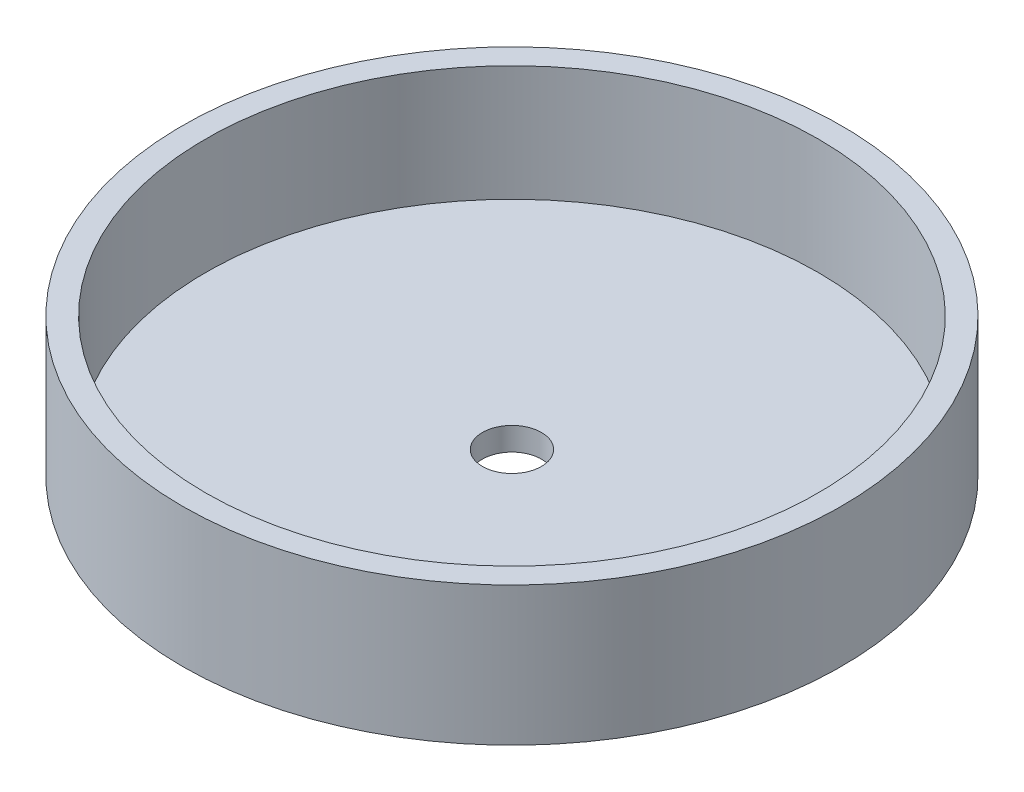
ISO-10303-21;
HEADER;
FILE_DESCRIPTION(('STEP AP214'),'2;1');
FILE_NAME('part.step','',(''),(''),'','','');
FILE_SCHEMA(('AUTOMOTIVE_DESIGN { 1 0 10303 214 1 1 1 1 }'));
ENDSEC;
DATA;
#1=APPLICATION_CONTEXT('core data for automotive mechanical design processes');
#2=APPLICATION_PROTOCOL_DEFINITION('international standard','automotive_design',2000,#1);
#3=PRODUCT_CONTEXT('',#1,'mechanical');
#4=PRODUCT('Part','Part','',(#3));
#5=PRODUCT_RELATED_PRODUCT_CATEGORY('part','',(#4));
#6=PRODUCT_DEFINITION_FORMATION('','',#4);
#7=PRODUCT_DEFINITION_CONTEXT('part definition',#1,'design');
#8=PRODUCT_DEFINITION('design','',#6,#7);
#9=PRODUCT_DEFINITION_SHAPE('','',#8);
#10=(LENGTH_UNIT() NAMED_UNIT(*) SI_UNIT(.MILLI.,.METRE.));
#11=(NAMED_UNIT(*) PLANE_ANGLE_UNIT() SI_UNIT($,.RADIAN.));
#12=(NAMED_UNIT(*) SI_UNIT($,.STERADIAN.) SOLID_ANGLE_UNIT());
#13=UNCERTAINTY_MEASURE_WITH_UNIT(LENGTH_MEASURE(1.E-05),#10,'distance_accuracy_value','');
#14=(GEOMETRIC_REPRESENTATION_CONTEXT(3) GLOBAL_UNCERTAINTY_ASSIGNED_CONTEXT((#13)) GLOBAL_UNIT_ASSIGNED_CONTEXT((#10,
#11,#12)) REPRESENTATION_CONTEXT('',''));
#15=CARTESIAN_POINT('',(0.,0.,0.));
#16=DIRECTION('',(0.,0.,1.));
#17=DIRECTION('',(1.,0.,0.));
#18=AXIS2_PLACEMENT_3D('',#15,#16,#17);
#19=CARTESIAN_POINT('',(0.,9.94623655913979,0.));
#20=DIRECTION('',(0.,1.,0.));
#21=DIRECTION('',(0.,0.,1.));
#22=AXIS2_PLACEMENT_3D('',#19,#20,#21);
#23=CYLINDRICAL_SURFACE('',#22,2.55);
#24=CARTESIAN_POINT('',(0.,-2.,0.));
#25=DIRECTION('',(0.,1.,0.));
#26=DIRECTION('',(0.,0.,1.));
#27=AXIS2_PLACEMENT_3D('',#24,#25,#26);
#28=CIRCLE('',#27,2.55);
#29=CARTESIAN_POINT('',(0.,-2.,2.55));
#30=VERTEX_POINT('',#29);
#31=EDGE_CURVE('E64',#30,#30,#28,.T.);
#32=ORIENTED_EDGE('',*,*,#31,.F.);
#33=EDGE_LOOP('',(#32));
#34=FACE_BOUND('',#33,.T.);
#35=CARTESIAN_POINT('',(0.,0.,0.));
#36=DIRECTION('',(0.,1.,0.));
#37=DIRECTION('',(0.,0.,1.));
#38=AXIS2_PLACEMENT_3D('',#35,#36,#37);
#39=CIRCLE('',#38,2.55);
#40=CARTESIAN_POINT('',(0.,0.,2.55));
#41=VERTEX_POINT('',#40);
#42=EDGE_CURVE('E10',#41,#41,#39,.T.);
#43=ORIENTED_EDGE('',*,*,#42,.T.);
#44=EDGE_LOOP('',(#43));
#45=FACE_BOUND('',#44,.T.);
#46=ADVANCED_FACE('F37',(#34,#45),#23,.F.);
#47=CARTESIAN_POINT('',(2.55,0.,0.));
#48=DIRECTION('',(0.,-1.,0.));
#49=DIRECTION('',(0.,0.,-1.));
#50=AXIS2_PLACEMENT_3D('',#47,#48,#49);
#51=PLANE('',#50);
#52=ORIENTED_EDGE('',*,*,#42,.F.);
#53=EDGE_LOOP('',(#52));
#54=FACE_BOUND('',#53,.T.);
#55=CARTESIAN_POINT('',(0.,0.,0.));
#56=DIRECTION('',(0.,1.,0.));
#57=DIRECTION('',(0.,0.,1.));
#58=AXIS2_PLACEMENT_3D('',#55,#56,#57);
#59=CIRCLE('',#58,26.5);
#60=CARTESIAN_POINT('',(0.,0.,26.5));
#61=VERTEX_POINT('',#60);
#62=EDGE_CURVE('E44',#61,#61,#59,.T.);
#63=ORIENTED_EDGE('',*,*,#62,.T.);
#64=EDGE_LOOP('',(#63));
#65=FACE_BOUND('',#64,.T.);
#66=ADVANCED_FACE('F72',(#54,#65),#51,.F.);
#67=CARTESIAN_POINT('',(0.,9.94623655913979,0.));
#68=DIRECTION('',(0.,1.,0.));
#69=DIRECTION('',(0.,0.,1.));
#70=AXIS2_PLACEMENT_3D('',#67,#68,#69);
#71=CYLINDRICAL_SURFACE('',#70,26.5);
#72=ORIENTED_EDGE('',*,*,#62,.F.);
#73=EDGE_LOOP('',(#72));
#74=FACE_BOUND('',#73,.T.);
#75=CARTESIAN_POINT('',(0.,10.,0.));
#76=DIRECTION('',(0.,1.,0.));
#77=DIRECTION('',(0.,0.,1.));
#78=AXIS2_PLACEMENT_3D('',#75,#76,#77);
#79=CIRCLE('',#78,26.5);
#80=CARTESIAN_POINT('',(0.,10.,26.5));
#81=VERTEX_POINT('',#80);
#82=EDGE_CURVE('E49',#81,#81,#79,.T.);
#83=ORIENTED_EDGE('',*,*,#82,.T.);
#84=EDGE_LOOP('',(#83));
#85=FACE_BOUND('',#84,.T.);
#86=ADVANCED_FACE('F76',(#74,#85),#71,.F.);
#87=CARTESIAN_POINT('',(26.5,10.,0.));
#88=DIRECTION('',(0.,-1.,0.));
#89=DIRECTION('',(0.,0.,-1.));
#90=AXIS2_PLACEMENT_3D('',#87,#88,#89);
#91=PLANE('',#90);
#92=ORIENTED_EDGE('',*,*,#82,.F.);
#93=EDGE_LOOP('',(#92));
#94=FACE_BOUND('',#93,.T.);
#95=CARTESIAN_POINT('',(0.,10.,0.));
#96=DIRECTION('',(0.,1.,0.));
#97=DIRECTION('',(0.,0.,1.));
#98=AXIS2_PLACEMENT_3D('',#95,#96,#97);
#99=CIRCLE('',#98,28.5);
#100=CARTESIAN_POINT('',(0.,10.,28.5));
#101=VERTEX_POINT('',#100);
#102=EDGE_CURVE('E54',#101,#101,#99,.T.);
#103=ORIENTED_EDGE('',*,*,#102,.T.);
#104=EDGE_LOOP('',(#103));
#105=FACE_BOUND('',#104,.T.);
#106=ADVANCED_FACE('F81',(#94,#105),#91,.F.);
#107=CARTESIAN_POINT('',(0.,9.94623655913979,0.));
#108=DIRECTION('',(0.,1.,0.));
#109=DIRECTION('',(0.,0.,1.));
#110=AXIS2_PLACEMENT_3D('',#107,#108,#109);
#111=CYLINDRICAL_SURFACE('',#110,28.5);
#112=ORIENTED_EDGE('',*,*,#102,.F.);
#113=EDGE_LOOP('',(#112));
#114=FACE_BOUND('',#113,.T.);
#115=CARTESIAN_POINT('',(0.,-2.,0.));
#116=DIRECTION('',(0.,1.,0.));
#117=DIRECTION('',(0.,0.,1.));
#118=AXIS2_PLACEMENT_3D('',#115,#116,#117);
#119=CIRCLE('',#118,28.5);
#120=CARTESIAN_POINT('',(0.,-2.,28.5));
#121=VERTEX_POINT('',#120);
#122=EDGE_CURVE('E60',#121,#121,#119,.T.);
#123=ORIENTED_EDGE('',*,*,#122,.T.);
#124=EDGE_LOOP('',(#123));
#125=FACE_BOUND('',#124,.T.);
#126=ADVANCED_FACE('F87',(#114,#125),#111,.T.);
#127=CARTESIAN_POINT('',(4.55,-2.,0.));
#128=DIRECTION('',(0.,1.,0.));
#129=DIRECTION('',(0.,0.,1.));
#130=AXIS2_PLACEMENT_3D('',#127,#128,#129);
#131=PLANE('',#130);
#132=ORIENTED_EDGE('',*,*,#122,.F.);
#133=EDGE_LOOP('',(#132));
#134=FACE_BOUND('',#133,.T.);
#135=ORIENTED_EDGE('',*,*,#31,.T.);
#136=EDGE_LOOP('',(#135));
#137=FACE_BOUND('',#136,.T.);
#138=ADVANCED_FACE('F69',(#134,#137),#131,.F.);
#139=CLOSED_SHELL('',(#46,#66,#86,#106,#126,#138));
#140=MANIFOLD_SOLID_BREP('B2',#139);
#141=ADVANCED_BREP_SHAPE_REPRESENTATION('',(#18,#140),#14);
#142=SHAPE_DEFINITION_REPRESENTATION(#9,#141);
ENDSEC;
END-ISO-10303-21;
